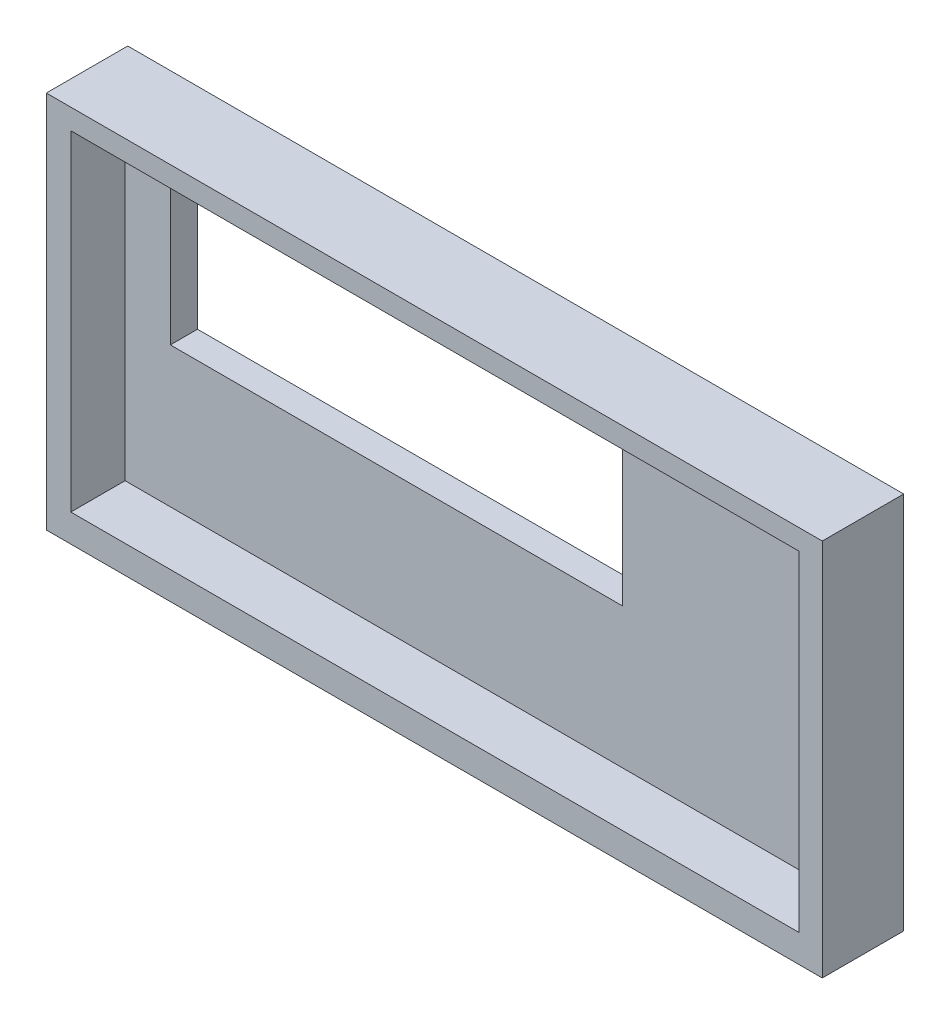
ISO-10303-21;
HEADER;
FILE_DESCRIPTION(('STEP AP214'),'2;1');
FILE_NAME('part.step','',(''),(''),'','','');
FILE_SCHEMA(('AUTOMOTIVE_DESIGN { 1 0 10303 214 1 1 1 1 }'));
ENDSEC;
DATA;
#1=APPLICATION_CONTEXT('core data for automotive mechanical design processes');
#2=APPLICATION_PROTOCOL_DEFINITION('international standard','automotive_design',2000,#1);
#3=PRODUCT_CONTEXT('',#1,'mechanical');
#4=PRODUCT('Part','Part','',(#3));
#5=PRODUCT_RELATED_PRODUCT_CATEGORY('part','',(#4));
#6=PRODUCT_DEFINITION_FORMATION('','',#4);
#7=PRODUCT_DEFINITION_CONTEXT('part definition',#1,'design');
#8=PRODUCT_DEFINITION('design','',#6,#7);
#9=PRODUCT_DEFINITION_SHAPE('','',#8);
#10=(LENGTH_UNIT() NAMED_UNIT(*) SI_UNIT(.MILLI.,.METRE.));
#11=(NAMED_UNIT(*) PLANE_ANGLE_UNIT() SI_UNIT($,.RADIAN.));
#12=(NAMED_UNIT(*) SI_UNIT($,.STERADIAN.) SOLID_ANGLE_UNIT());
#13=UNCERTAINTY_MEASURE_WITH_UNIT(LENGTH_MEASURE(1.E-05),#10,'distance_accuracy_value','');
#14=(GEOMETRIC_REPRESENTATION_CONTEXT(3) GLOBAL_UNCERTAINTY_ASSIGNED_CONTEXT((#13)) GLOBAL_UNIT_ASSIGNED_CONTEXT((#10,
#11,#12)) REPRESENTATION_CONTEXT('',''));
#15=CARTESIAN_POINT('',(0.,0.,0.));
#16=DIRECTION('',(0.,0.,1.));
#17=DIRECTION('',(1.,0.,0.));
#18=AXIS2_PLACEMENT_3D('',#15,#16,#17);
#19=CARTESIAN_POINT('',(0.,0.,0.));
#20=DIRECTION('',(0.,0.,-1.));
#21=DIRECTION('',(-1.,0.,0.));
#22=AXIS2_PLACEMENT_3D('',#19,#20,#21);
#23=PLANE('',#22);
#24=DIRECTION('',(0.,-1.,0.));
#25=VECTOR('',#24,1.);
#26=CARTESIAN_POINT('',(-29.2313084112149,25.7299065420561,0.));
#27=LINE('',#26,#25);
#28=CARTESIAN_POINT('',(-29.2313084112149,25.7299065420561,0.));
#29=VERTEX_POINT('',#28);
#30=CARTESIAN_POINT('',(-29.2313084112149,4.72990654205607,0.));
#31=VERTEX_POINT('',#30);
#32=EDGE_CURVE('E137',#29,#31,#27,.T.);
#33=ORIENTED_EDGE('',*,*,#32,.F.);
#34=DIRECTION('',(-1.,0.,0.));
#35=VECTOR('',#34,1.);
#36=CARTESIAN_POINT('',(-34.2313084112149,25.7299065420561,0.));
#37=LINE('',#36,#35);
#38=CARTESIAN_POINT('',(-34.2313084112149,25.7299065420561,0.));
#39=VERTEX_POINT('',#38);
#40=EDGE_CURVE('E186',#29,#39,#37,.T.);
#41=ORIENTED_EDGE('',*,*,#40,.T.);
#42=DIRECTION('',(0.,-1.,0.));
#43=VECTOR('',#42,1.);
#44=CARTESIAN_POINT('',(-34.2313084112149,25.7299065420561,0.));
#45=LINE('',#44,#43);
#46=CARTESIAN_POINT('',(-34.2313084112149,-10.7700934579439,0.));
#47=VERTEX_POINT('',#46);
#48=EDGE_CURVE('E166',#39,#47,#45,.T.);
#49=ORIENTED_EDGE('',*,*,#48,.T.);
#50=DIRECTION('',(1.,0.,0.));
#51=VECTOR('',#50,1.);
#52=CARTESIAN_POINT('',(-34.2313084112149,-10.7700934579439,0.));
#53=LINE('',#52,#51);
#54=CARTESIAN_POINT('',(46.268691588785,-10.7700934579439,0.));
#55=VERTEX_POINT('',#54);
#56=EDGE_CURVE('E180',#47,#55,#53,.T.);
#57=ORIENTED_EDGE('',*,*,#56,.T.);
#58=DIRECTION('',(0.,1.,0.));
#59=VECTOR('',#58,1.);
#60=CARTESIAN_POINT('',(46.268691588785,25.7299065420561,0.));
#61=LINE('',#60,#59);
#62=CARTESIAN_POINT('',(46.268691588785,25.7299065420561,0.));
#63=VERTEX_POINT('',#62);
#64=EDGE_CURVE('E183',#55,#63,#61,.T.);
#65=ORIENTED_EDGE('',*,*,#64,.T.);
#66=CARTESIAN_POINT('',(20.7686915887851,25.7299065420561,0.));
#67=VERTEX_POINT('',#66);
#68=EDGE_CURVE('E170',#63,#67,#37,.T.);
#69=ORIENTED_EDGE('',*,*,#68,.T.);
#70=DIRECTION('',(0.,1.,0.));
#71=VECTOR('',#70,1.);
#72=CARTESIAN_POINT('',(20.7686915887851,25.7299065420561,0.));
#73=LINE('',#72,#71);
#74=CARTESIAN_POINT('',(20.7686915887851,4.72990654205607,0.));
#75=VERTEX_POINT('',#74);
#76=EDGE_CURVE('E134',#75,#67,#73,.T.);
#77=ORIENTED_EDGE('',*,*,#76,.F.);
#78=DIRECTION('',(1.,0.,0.));
#79=VECTOR('',#78,1.);
#80=CARTESIAN_POINT('',(-29.2313084112149,4.72990654205607,0.));
#81=LINE('',#80,#79);
#82=EDGE_CURVE('E58',#31,#75,#81,.T.);
#83=ORIENTED_EDGE('',*,*,#82,.F.);
#84=EDGE_LOOP('',(#33,#41,#49,#57,#65,#69,#77,#83));
#85=FACE_BOUND('',#84,.T.);
#86=ADVANCED_FACE('F43',(#85),#23,.F.);
#87=CARTESIAN_POINT('',(0.,0.,6.));
#88=DIRECTION('',(0.,0.,1.));
#89=DIRECTION('',(1.,0.,0.));
#90=AXIS2_PLACEMENT_3D('',#87,#88,#89);
#91=PLANE('',#90);
#92=DIRECTION('',(0.,-1.,0.));
#93=VECTOR('',#92,1.);
#94=CARTESIAN_POINT('',(-36.9397196261682,27.9869158878505,6.));
#95=LINE('',#94,#93);
#96=CARTESIAN_POINT('',(-36.9397196261682,27.9869158878505,6.));
#97=VERTEX_POINT('',#96);
#98=CARTESIAN_POINT('',(-36.9397196261682,-13.8429906542056,6.));
#99=VERTEX_POINT('',#98);
#100=EDGE_CURVE('E197',#97,#99,#95,.T.);
#101=ORIENTED_EDGE('',*,*,#100,.T.);
#102=DIRECTION('',(1.,0.,0.));
#103=VECTOR('',#102,1.);
#104=CARTESIAN_POINT('',(-36.9397196261682,-13.8429906542056,6.));
#105=LINE('',#104,#103);
#106=CARTESIAN_POINT('',(48.8266355140187,-13.8429906542056,6.));
#107=VERTEX_POINT('',#106);
#108=EDGE_CURVE('E200',#99,#107,#105,.T.);
#109=ORIENTED_EDGE('',*,*,#108,.T.);
#110=DIRECTION('',(0.,1.,0.));
#111=VECTOR('',#110,1.);
#112=CARTESIAN_POINT('',(48.8266355140187,27.9869158878505,6.));
#113=LINE('',#112,#111);
#114=CARTESIAN_POINT('',(48.8266355140187,27.9869158878505,6.));
#115=VERTEX_POINT('',#114);
#116=EDGE_CURVE('E202',#107,#115,#113,.T.);
#117=ORIENTED_EDGE('',*,*,#116,.T.);
#118=DIRECTION('',(-1.,0.,0.));
#119=VECTOR('',#118,1.);
#120=CARTESIAN_POINT('',(-36.9397196261682,27.9869158878505,6.));
#121=LINE('',#120,#119);
#122=EDGE_CURVE('E204',#115,#97,#121,.T.);
#123=ORIENTED_EDGE('',*,*,#122,.T.);
#124=EDGE_LOOP('',(#101,#109,#117,#123));
#125=FACE_BOUND('',#124,.T.);
#126=DIRECTION('',(1.,0.,0.));
#127=VECTOR('',#126,1.);
#128=CARTESIAN_POINT('',(-34.2313084112149,-10.7700934579439,6.));
#129=LINE('',#128,#127);
#130=CARTESIAN_POINT('',(-34.2313084112149,-10.7700934579439,6.));
#131=VERTEX_POINT('',#130);
#132=CARTESIAN_POINT('',(46.268691588785,-10.7700934579439,6.));
#133=VERTEX_POINT('',#132);
#134=EDGE_CURVE('E169',#131,#133,#129,.T.);
#135=ORIENTED_EDGE('',*,*,#134,.F.);
#136=DIRECTION('',(0.,-1.,0.));
#137=VECTOR('',#136,1.);
#138=CARTESIAN_POINT('',(-34.2313084112149,25.7299065420561,6.));
#139=LINE('',#138,#137);
#140=CARTESIAN_POINT('',(-34.2313084112149,25.7299065420561,6.));
#141=VERTEX_POINT('',#140);
#142=EDGE_CURVE('E167',#141,#131,#139,.T.);
#143=ORIENTED_EDGE('',*,*,#142,.F.);
#144=DIRECTION('',(-1.,0.,0.));
#145=VECTOR('',#144,1.);
#146=CARTESIAN_POINT('',(-34.2313084112149,25.7299065420561,6.));
#147=LINE('',#146,#145);
#148=CARTESIAN_POINT('',(46.268691588785,25.7299065420561,6.));
#149=VERTEX_POINT('',#148);
#150=EDGE_CURVE('E175',#149,#141,#147,.T.);
#151=ORIENTED_EDGE('',*,*,#150,.F.);
#152=DIRECTION('',(0.,1.,0.));
#153=VECTOR('',#152,1.);
#154=CARTESIAN_POINT('',(46.268691588785,25.7299065420561,6.));
#155=LINE('',#154,#153);
#156=EDGE_CURVE('E172',#133,#149,#155,.T.);
#157=ORIENTED_EDGE('',*,*,#156,.F.);
#158=EDGE_LOOP('',(#135,#143,#151,#157));
#159=FACE_BOUND('',#158,.T.);
#160=ADVANCED_FACE('F248',(#125,#159),#91,.T.);
#161=CARTESIAN_POINT('',(-36.9397196261682,27.9869158878505,6.));
#162=DIRECTION('',(1.,0.,0.));
#163=DIRECTION('',(0.,0.,-1.));
#164=AXIS2_PLACEMENT_3D('',#161,#162,#163);
#165=PLANE('',#164);
#166=DIRECTION('',(0.,0.,-1.));
#167=VECTOR('',#166,1.);
#168=CARTESIAN_POINT('',(-36.9397196261682,27.9869158878505,6.));
#169=LINE('',#168,#167);
#170=CARTESIAN_POINT('',(-36.9397196261682,27.9869158878505,-3.));
#171=VERTEX_POINT('',#170);
#172=EDGE_CURVE('E206',#97,#171,#169,.T.);
#173=ORIENTED_EDGE('',*,*,#172,.T.);
#174=DIRECTION('',(0.,1.,0.));
#175=VECTOR('',#174,1.);
#176=CARTESIAN_POINT('',(-36.9397196261682,27.9869158878505,-3.));
#177=LINE('',#176,#175);
#178=CARTESIAN_POINT('',(-36.9397196261682,-13.8429906542056,-3.));
#179=VERTEX_POINT('',#178);
#180=EDGE_CURVE('E160',#179,#171,#177,.T.);
#181=ORIENTED_EDGE('',*,*,#180,.F.);
#182=DIRECTION('',(0.,0.,-1.));
#183=VECTOR('',#182,1.);
#184=CARTESIAN_POINT('',(-36.9397196261682,-13.8429906542056,6.));
#185=LINE('',#184,#183);
#186=EDGE_CURVE('E212',#99,#179,#185,.T.);
#187=ORIENTED_EDGE('',*,*,#186,.F.);
#188=ORIENTED_EDGE('',*,*,#100,.F.);
#189=EDGE_LOOP('',(#173,#181,#187,#188));
#190=FACE_BOUND('',#189,.T.);
#191=ADVANCED_FACE('F45',(#190),#165,.F.);
#192=CARTESIAN_POINT('',(-36.9397196261682,-13.8429906542056,6.));
#193=DIRECTION('',(0.,1.,0.));
#194=DIRECTION('',(0.,0.,1.));
#195=AXIS2_PLACEMENT_3D('',#192,#193,#194);
#196=PLANE('',#195);
#197=ORIENTED_EDGE('',*,*,#186,.T.);
#198=DIRECTION('',(-1.,0.,0.));
#199=VECTOR('',#198,1.);
#200=CARTESIAN_POINT('',(48.8266355140187,-13.8429906542056,-3.));
#201=LINE('',#200,#199);
#202=CARTESIAN_POINT('',(48.8266355140187,-13.8429906542056,-3.));
#203=VERTEX_POINT('',#202);
#204=EDGE_CURVE('E157',#203,#179,#201,.T.);
#205=ORIENTED_EDGE('',*,*,#204,.F.);
#206=DIRECTION('',(0.,0.,-1.));
#207=VECTOR('',#206,1.);
#208=CARTESIAN_POINT('',(48.8266355140187,-13.8429906542056,6.));
#209=LINE('',#208,#207);
#210=EDGE_CURVE('E210',#107,#203,#209,.T.);
#211=ORIENTED_EDGE('',*,*,#210,.F.);
#212=ORIENTED_EDGE('',*,*,#108,.F.);
#213=EDGE_LOOP('',(#197,#205,#211,#212));
#214=FACE_BOUND('',#213,.T.);
#215=ADVANCED_FACE('F240',(#214),#196,.F.);
#216=CARTESIAN_POINT('',(48.8266355140187,27.9869158878505,6.));
#217=DIRECTION('',(-1.,0.,0.));
#218=DIRECTION('',(0.,0.,1.));
#219=AXIS2_PLACEMENT_3D('',#216,#217,#218);
#220=PLANE('',#219);
#221=ORIENTED_EDGE('',*,*,#210,.T.);
#222=DIRECTION('',(0.,-1.,0.));
#223=VECTOR('',#222,1.);
#224=CARTESIAN_POINT('',(48.8266355140187,27.9869158878505,-3.));
#225=LINE('',#224,#223);
#226=CARTESIAN_POINT('',(48.8266355140187,27.9869158878505,-3.));
#227=VERTEX_POINT('',#226);
#228=EDGE_CURVE('E151',#227,#203,#225,.T.);
#229=ORIENTED_EDGE('',*,*,#228,.F.);
#230=DIRECTION('',(0.,0.,-1.));
#231=VECTOR('',#230,1.);
#232=CARTESIAN_POINT('',(48.8266355140187,27.9869158878505,6.));
#233=LINE('',#232,#231);
#234=EDGE_CURVE('E208',#115,#227,#233,.T.);
#235=ORIENTED_EDGE('',*,*,#234,.F.);
#236=ORIENTED_EDGE('',*,*,#116,.F.);
#237=EDGE_LOOP('',(#221,#229,#235,#236));
#238=FACE_BOUND('',#237,.T.);
#239=ADVANCED_FACE('F235',(#238),#220,.F.);
#240=CARTESIAN_POINT('',(-36.9397196261682,27.9869158878505,6.));
#241=DIRECTION('',(0.,-1.,0.));
#242=DIRECTION('',(0.,0.,-1.));
#243=AXIS2_PLACEMENT_3D('',#240,#241,#242);
#244=PLANE('',#243);
#245=ORIENTED_EDGE('',*,*,#234,.T.);
#246=DIRECTION('',(1.,0.,0.));
#247=VECTOR('',#246,1.);
#248=CARTESIAN_POINT('',(48.8266355140187,27.9869158878505,-3.));
#249=LINE('',#248,#247);
#250=EDGE_CURVE('E163',#171,#227,#249,.T.);
#251=ORIENTED_EDGE('',*,*,#250,.F.);
#252=ORIENTED_EDGE('',*,*,#172,.F.);
#253=ORIENTED_EDGE('',*,*,#122,.F.);
#254=EDGE_LOOP('',(#245,#251,#252,#253));
#255=FACE_BOUND('',#254,.T.);
#256=ADVANCED_FACE('F246',(#255),#244,.F.);
#257=CARTESIAN_POINT('',(-34.2313084112149,25.7299065420561,6.));
#258=DIRECTION('',(1.,0.,0.));
#259=DIRECTION('',(0.,0.,-1.));
#260=AXIS2_PLACEMENT_3D('',#257,#258,#259);
#261=PLANE('',#260);
#262=ORIENTED_EDGE('',*,*,#48,.F.);
#263=DIRECTION('',(0.,0.,-1.));
#264=VECTOR('',#263,1.);
#265=CARTESIAN_POINT('',(-34.2313084112149,25.7299065420561,6.));
#266=LINE('',#265,#264);
#267=EDGE_CURVE('E177',#141,#39,#266,.T.);
#268=ORIENTED_EDGE('',*,*,#267,.F.);
#269=ORIENTED_EDGE('',*,*,#142,.T.);
#270=DIRECTION('',(0.,0.,-1.));
#271=VECTOR('',#270,1.);
#272=CARTESIAN_POINT('',(-34.2313084112149,-10.7700934579439,6.));
#273=LINE('',#272,#271);
#274=EDGE_CURVE('E194',#131,#47,#273,.T.);
#275=ORIENTED_EDGE('',*,*,#274,.T.);
#276=EDGE_LOOP('',(#262,#268,#269,#275));
#277=FACE_BOUND('',#276,.T.);
#278=ADVANCED_FACE('F265',(#277),#261,.T.);
#279=CARTESIAN_POINT('',(-34.2313084112149,-10.7700934579439,6.));
#280=DIRECTION('',(0.,1.,0.));
#281=DIRECTION('',(0.,0.,1.));
#282=AXIS2_PLACEMENT_3D('',#279,#280,#281);
#283=PLANE('',#282);
#284=ORIENTED_EDGE('',*,*,#56,.F.);
#285=ORIENTED_EDGE('',*,*,#274,.F.);
#286=ORIENTED_EDGE('',*,*,#134,.T.);
#287=DIRECTION('',(0.,0.,-1.));
#288=VECTOR('',#287,1.);
#289=CARTESIAN_POINT('',(46.268691588785,-10.7700934579439,6.));
#290=LINE('',#289,#288);
#291=EDGE_CURVE('E192',#133,#55,#290,.T.);
#292=ORIENTED_EDGE('',*,*,#291,.T.);
#293=EDGE_LOOP('',(#284,#285,#286,#292));
#294=FACE_BOUND('',#293,.T.);
#295=ADVANCED_FACE('F259',(#294),#283,.T.);
#296=CARTESIAN_POINT('',(46.268691588785,25.7299065420561,6.));
#297=DIRECTION('',(-1.,0.,0.));
#298=DIRECTION('',(0.,0.,1.));
#299=AXIS2_PLACEMENT_3D('',#296,#297,#298);
#300=PLANE('',#299);
#301=ORIENTED_EDGE('',*,*,#64,.F.);
#302=ORIENTED_EDGE('',*,*,#291,.F.);
#303=ORIENTED_EDGE('',*,*,#156,.T.);
#304=DIRECTION('',(0.,0.,-1.));
#305=VECTOR('',#304,1.);
#306=CARTESIAN_POINT('',(46.268691588785,25.7299065420561,6.));
#307=LINE('',#306,#305);
#308=EDGE_CURVE('E190',#149,#63,#307,.T.);
#309=ORIENTED_EDGE('',*,*,#308,.T.);
#310=EDGE_LOOP('',(#301,#302,#303,#309));
#311=FACE_BOUND('',#310,.T.);
#312=ADVANCED_FACE('F262',(#311),#300,.T.);
#313=CARTESIAN_POINT('',(-34.2313084112149,25.7299065420561,6.));
#314=DIRECTION('',(0.,-1.,0.));
#315=DIRECTION('',(0.,0.,-1.));
#316=AXIS2_PLACEMENT_3D('',#313,#314,#315);
#317=PLANE('',#316);
#318=ORIENTED_EDGE('',*,*,#68,.F.);
#319=ORIENTED_EDGE('',*,*,#308,.F.);
#320=ORIENTED_EDGE('',*,*,#150,.T.);
#321=ORIENTED_EDGE('',*,*,#267,.T.);
#322=ORIENTED_EDGE('',*,*,#40,.F.);
#323=DIRECTION('',(0.,0.,1.));
#324=VECTOR('',#323,1.);
#325=CARTESIAN_POINT('',(-29.2313084112149,25.7299065420561,-10.));
#326=LINE('',#325,#324);
#327=CARTESIAN_POINT('',(-29.2313084112149,25.7299065420561,-3.));
#328=VERTEX_POINT('',#327);
#329=EDGE_CURVE('E140',#328,#29,#326,.T.);
#330=ORIENTED_EDGE('',*,*,#329,.F.);
#331=DIRECTION('',(1.,0.,0.));
#332=VECTOR('',#331,1.);
#333=CARTESIAN_POINT('',(0.,25.7299065420561,-3.));
#334=LINE('',#333,#332);
#335=CARTESIAN_POINT('',(20.7686915887851,25.7299065420561,-3.));
#336=VERTEX_POINT('',#335);
#337=EDGE_CURVE('E51',#328,#336,#334,.T.);
#338=ORIENTED_EDGE('',*,*,#337,.T.);
#339=DIRECTION('',(0.,0.,1.));
#340=VECTOR('',#339,1.);
#341=CARTESIAN_POINT('',(20.7686915887851,25.7299065420561,-10.));
#342=LINE('',#341,#340);
#343=EDGE_CURVE('E152',#336,#67,#342,.T.);
#344=ORIENTED_EDGE('',*,*,#343,.T.);
#345=EDGE_LOOP('',(#318,#319,#320,#321,#322,#330,#338,#344));
#346=FACE_BOUND('',#345,.T.);
#347=ADVANCED_FACE('F220',(#346),#317,.T.);
#348=CARTESIAN_POINT('',(0.,0.,-3.));
#349=DIRECTION('',(0.,0.,-1.));
#350=DIRECTION('',(-1.,0.,0.));
#351=AXIS2_PLACEMENT_3D('',#348,#349,#350);
#352=PLANE('',#351);
#353=DIRECTION('',(0.,1.,0.));
#354=VECTOR('',#353,1.);
#355=CARTESIAN_POINT('',(-29.2313084112149,0.,-3.));
#356=LINE('',#355,#354);
#357=CARTESIAN_POINT('',(-29.2313084112149,4.72990654205607,-3.));
#358=VERTEX_POINT('',#357);
#359=EDGE_CURVE('E11',#358,#328,#356,.T.);
#360=ORIENTED_EDGE('',*,*,#359,.F.);
#361=DIRECTION('',(-1.,0.,0.));
#362=VECTOR('',#361,1.);
#363=CARTESIAN_POINT('',(0.,4.72990654205607,-3.));
#364=LINE('',#363,#362);
#365=CARTESIAN_POINT('',(20.7686915887851,4.72990654205607,-3.));
#366=VERTEX_POINT('',#365);
#367=EDGE_CURVE('E131',#366,#358,#364,.T.);
#368=ORIENTED_EDGE('',*,*,#367,.F.);
#369=DIRECTION('',(0.,-1.,0.));
#370=VECTOR('',#369,1.);
#371=CARTESIAN_POINT('',(20.7686915887851,0.,-3.));
#372=LINE('',#371,#370);
#373=EDGE_CURVE('E215',#336,#366,#372,.T.);
#374=ORIENTED_EDGE('',*,*,#373,.F.);
#375=ORIENTED_EDGE('',*,*,#337,.F.);
#376=EDGE_LOOP('',(#360,#368,#374,#375));
#377=FACE_BOUND('',#376,.T.);
#378=ORIENTED_EDGE('',*,*,#228,.T.);
#379=ORIENTED_EDGE('',*,*,#204,.T.);
#380=ORIENTED_EDGE('',*,*,#180,.T.);
#381=ORIENTED_EDGE('',*,*,#250,.T.);
#382=EDGE_LOOP('',(#378,#379,#380,#381));
#383=FACE_BOUND('',#382,.T.);
#384=ADVANCED_FACE('F225',(#377,#383),#352,.T.);
#385=CARTESIAN_POINT('',(-29.2313084112149,25.7299065420561,-10.));
#386=DIRECTION('',(-1.,0.,0.));
#387=DIRECTION('',(0.,-1.,0.));
#388=AXIS2_PLACEMENT_3D('',#385,#386,#387);
#389=PLANE('',#388);
#390=ORIENTED_EDGE('',*,*,#359,.T.);
#391=ORIENTED_EDGE('',*,*,#329,.T.);
#392=ORIENTED_EDGE('',*,*,#32,.T.);
#393=DIRECTION('',(0.,0.,1.));
#394=VECTOR('',#393,1.);
#395=CARTESIAN_POINT('',(-29.2313084112149,4.72990654205607,-10.));
#396=LINE('',#395,#394);
#397=EDGE_CURVE('E127',#358,#31,#396,.T.);
#398=ORIENTED_EDGE('',*,*,#397,.F.);
#399=EDGE_LOOP('',(#390,#391,#392,#398));
#400=FACE_BOUND('',#399,.T.);
#401=ADVANCED_FACE('F138',(#400),#389,.F.);
#402=CARTESIAN_POINT('',(20.7686915887851,25.7299065420561,-10.));
#403=DIRECTION('',(1.,0.,0.));
#404=DIRECTION('',(0.,0.,-1.));
#405=AXIS2_PLACEMENT_3D('',#402,#403,#404);
#406=PLANE('',#405);
#407=ORIENTED_EDGE('',*,*,#373,.T.);
#408=DIRECTION('',(0.,0.,1.));
#409=VECTOR('',#408,1.);
#410=CARTESIAN_POINT('',(20.7686915887851,4.72990654205607,-10.));
#411=LINE('',#410,#409);
#412=EDGE_CURVE('E62',#366,#75,#411,.T.);
#413=ORIENTED_EDGE('',*,*,#412,.T.);
#414=ORIENTED_EDGE('',*,*,#76,.T.);
#415=ORIENTED_EDGE('',*,*,#343,.F.);
#416=EDGE_LOOP('',(#407,#413,#414,#415));
#417=FACE_BOUND('',#416,.T.);
#418=ADVANCED_FACE('F224',(#417),#406,.F.);
#419=CARTESIAN_POINT('',(-29.2313084112149,4.72990654205607,-10.));
#420=DIRECTION('',(0.,-1.,0.));
#421=DIRECTION('',(0.,0.,-1.));
#422=AXIS2_PLACEMENT_3D('',#419,#420,#421);
#423=PLANE('',#422);
#424=ORIENTED_EDGE('',*,*,#367,.T.);
#425=ORIENTED_EDGE('',*,*,#397,.T.);
#426=ORIENTED_EDGE('',*,*,#82,.T.);
#427=ORIENTED_EDGE('',*,*,#412,.F.);
#428=EDGE_LOOP('',(#424,#425,#426,#427));
#429=FACE_BOUND('',#428,.T.);
#430=ADVANCED_FACE('F129',(#429),#423,.F.);
#431=CLOSED_SHELL('',(#86,#160,#191,#215,#239,#256,#278,#295,#312,#347,#384,#401,#418,#430));
#432=MANIFOLD_SOLID_BREP('B2',#431);
#433=ADVANCED_BREP_SHAPE_REPRESENTATION('',(#18,#432),#14);
#434=SHAPE_DEFINITION_REPRESENTATION(#9,#433);
ENDSEC;
END-ISO-10303-21;
